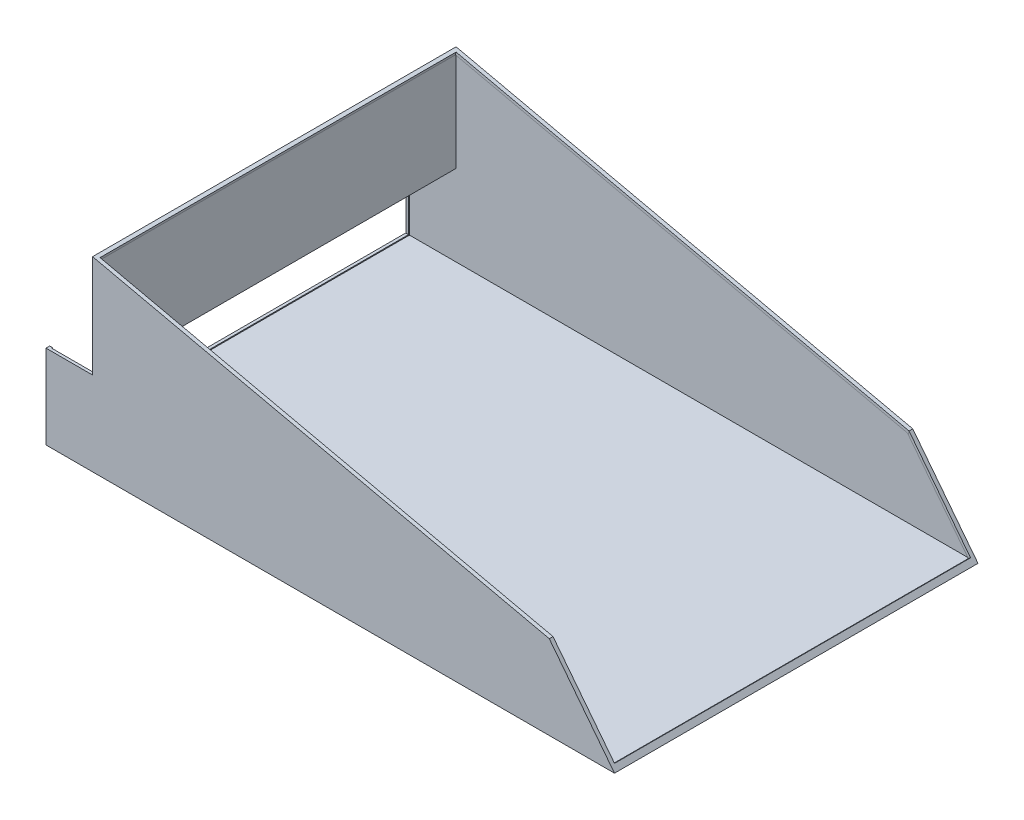
ISO-10303-21;
HEADER;
FILE_DESCRIPTION(('STEP AP214'),'2;1');
FILE_NAME('part.step','',(''),(''),'','','');
FILE_SCHEMA(('AUTOMOTIVE_DESIGN { 1 0 10303 214 1 1 1 1 }'));
ENDSEC;
DATA;
#1=APPLICATION_CONTEXT('core data for automotive mechanical design processes');
#2=APPLICATION_PROTOCOL_DEFINITION('international standard','automotive_design',2000,#1);
#3=PRODUCT_CONTEXT('',#1,'mechanical');
#4=PRODUCT('Part','Part','',(#3));
#5=PRODUCT_RELATED_PRODUCT_CATEGORY('part','',(#4));
#6=PRODUCT_DEFINITION_FORMATION('','',#4);
#7=PRODUCT_DEFINITION_CONTEXT('part definition',#1,'design');
#8=PRODUCT_DEFINITION('design','',#6,#7);
#9=PRODUCT_DEFINITION_SHAPE('','',#8);
#10=(LENGTH_UNIT() NAMED_UNIT(*) SI_UNIT(.MILLI.,.METRE.));
#11=(NAMED_UNIT(*) PLANE_ANGLE_UNIT() SI_UNIT($,.RADIAN.));
#12=(NAMED_UNIT(*) SI_UNIT($,.STERADIAN.) SOLID_ANGLE_UNIT());
#13=UNCERTAINTY_MEASURE_WITH_UNIT(LENGTH_MEASURE(1.E-05),#10,'distance_accuracy_value','');
#14=(GEOMETRIC_REPRESENTATION_CONTEXT(3) GLOBAL_UNCERTAINTY_ASSIGNED_CONTEXT((#13)) GLOBAL_UNIT_ASSIGNED_CONTEXT((#10,
#11,#12)) REPRESENTATION_CONTEXT('',''));
#15=CARTESIAN_POINT('',(0.,0.,0.));
#16=DIRECTION('',(0.,0.,1.));
#17=DIRECTION('',(1.,0.,0.));
#18=AXIS2_PLACEMENT_3D('',#15,#16,#17);
#19=CARTESIAN_POINT('',(0.,45.,97.5));
#20=DIRECTION('',(0.,-1.,0.));
#21=DIRECTION('',(1.,0.,0.));
#22=AXIS2_PLACEMENT_3D('',#19,#20,#21);
#23=PLANE('',#22);
#24=DIRECTION('',(-1.,0.,0.));
#25=VECTOR('',#24,1.);
#26=CARTESIAN_POINT('',(0.,45.,-96.));
#27=LINE('',#26,#25);
#28=CARTESIAN_POINT('',(0.,45.,-96.));
#29=VERTEX_POINT('',#28);
#30=CARTESIAN_POINT('',(-23.5,45.,-96.));
#31=VERTEX_POINT('',#30);
#32=EDGE_CURVE('E11',#29,#31,#27,.T.);
#33=ORIENTED_EDGE('',*,*,#32,.F.);
#34=DIRECTION('',(0.,0.,-1.));
#35=VECTOR('',#34,1.);
#36=CARTESIAN_POINT('',(0.,45.,97.5));
#37=LINE('',#36,#35);
#38=CARTESIAN_POINT('',(0.,45.,-97.5));
#39=VERTEX_POINT('',#38);
#40=EDGE_CURVE('E421',#29,#39,#37,.T.);
#41=ORIENTED_EDGE('',*,*,#40,.T.);
#42=DIRECTION('',(-1.,0.,0.));
#43=VECTOR('',#42,1.);
#44=CARTESIAN_POINT('',(0.,45.,-97.5));
#45=LINE('',#44,#43);
#46=CARTESIAN_POINT('',(-25.,45.,-97.5));
#47=VERTEX_POINT('',#46);
#48=EDGE_CURVE('E410',#39,#47,#45,.T.);
#49=ORIENTED_EDGE('',*,*,#48,.T.);
#50=DIRECTION('',(0.,0.,-1.));
#51=VECTOR('',#50,1.);
#52=CARTESIAN_POINT('',(-25.,45.,97.5));
#53=LINE('',#52,#51);
#54=CARTESIAN_POINT('',(-25.,45.,-95.5));
#55=VERTEX_POINT('',#54);
#56=EDGE_CURVE('E417',#55,#47,#53,.T.);
#57=ORIENTED_EDGE('',*,*,#56,.F.);
#58=DIRECTION('',(1.,0.,0.));
#59=VECTOR('',#58,1.);
#60=CARTESIAN_POINT('',(-25.,45.,-95.5));
#61=LINE('',#60,#59);
#62=CARTESIAN_POINT('',(-23.5,45.,-95.5));
#63=VERTEX_POINT('',#62);
#64=EDGE_CURVE('E370',#63,#55,#61,.F.);
#65=ORIENTED_EDGE('',*,*,#64,.F.);
#66=DIRECTION('',(0.,0.,-1.));
#67=VECTOR('',#66,1.);
#68=CARTESIAN_POINT('',(-23.5,45.,97.5));
#69=LINE('',#68,#67);
#70=EDGE_CURVE('E328',#63,#31,#69,.T.);
#71=ORIENTED_EDGE('',*,*,#70,.T.);
#72=EDGE_LOOP('',(#33,#41,#49,#57,#65,#71));
#73=FACE_BOUND('',#72,.T.);
#74=ADVANCED_FACE('F37',(#73),#23,.F.);
#75=CARTESIAN_POINT('',(-25.,45.,97.5));
#76=DIRECTION('',(1.,0.,0.));
#77=DIRECTION('',(0.,1.,0.));
#78=AXIS2_PLACEMENT_3D('',#75,#76,#77);
#79=PLANE('',#78);
#80=DIRECTION('',(0.,-1.,0.));
#81=VECTOR('',#80,1.);
#82=CARTESIAN_POINT('',(-25.,45.,-95.5));
#83=LINE('',#82,#81);
#84=CARTESIAN_POINT('',(-25.,43.0000000000001,-95.5));
#85=VERTEX_POINT('',#84);
#86=EDGE_CURVE('E41',#55,#85,#83,.T.);
#87=ORIENTED_EDGE('',*,*,#86,.F.);
#88=ORIENTED_EDGE('',*,*,#56,.T.);
#89=DIRECTION('',(0.,-1.,0.));
#90=VECTOR('',#89,1.);
#91=CARTESIAN_POINT('',(-25.,45.,-97.5));
#92=LINE('',#91,#90);
#93=CARTESIAN_POINT('',(-25.,0.,-97.5));
#94=VERTEX_POINT('',#93);
#95=EDGE_CURVE('E390',#47,#94,#92,.T.);
#96=ORIENTED_EDGE('',*,*,#95,.T.);
#97=DIRECTION('',(0.,0.,-1.));
#98=VECTOR('',#97,1.);
#99=CARTESIAN_POINT('',(-25.,0.,97.5));
#100=LINE('',#99,#98);
#101=CARTESIAN_POINT('',(-25.,0.,97.5));
#102=VERTEX_POINT('',#101);
#103=EDGE_CURVE('E400',#102,#94,#100,.T.);
#104=ORIENTED_EDGE('',*,*,#103,.F.);
#105=DIRECTION('',(0.,-1.,0.));
#106=VECTOR('',#105,1.);
#107=CARTESIAN_POINT('',(-25.,45.,97.5));
#108=LINE('',#107,#106);
#109=CARTESIAN_POINT('',(-25.,45.,97.5));
#110=VERTEX_POINT('',#109);
#111=EDGE_CURVE('E398',#110,#102,#108,.T.);
#112=ORIENTED_EDGE('',*,*,#111,.F.);
#113=CARTESIAN_POINT('',(-25.,45.,95.5));
#114=VERTEX_POINT('',#113);
#115=EDGE_CURVE('E418',#110,#114,#53,.T.);
#116=ORIENTED_EDGE('',*,*,#115,.T.);
#117=DIRECTION('',(0.,1.,0.));
#118=VECTOR('',#117,1.);
#119=CARTESIAN_POINT('',(-25.,45.,95.5));
#120=LINE('',#119,#118);
#121=CARTESIAN_POINT('',(-25.,43.,95.5));
#122=VERTEX_POINT('',#121);
#123=EDGE_CURVE('E256',#122,#114,#120,.T.);
#124=ORIENTED_EDGE('',*,*,#123,.F.);
#125=DIRECTION('',(0.,1.,0.));
#126=VECTOR('',#125,1.);
#127=CARTESIAN_POINT('',(-25.,45.,95.5));
#128=LINE('',#127,#126);
#129=CARTESIAN_POINT('',(-25.,2.,95.5));
#130=VERTEX_POINT('',#129);
#131=EDGE_CURVE('E261',#130,#122,#128,.T.);
#132=ORIENTED_EDGE('',*,*,#131,.F.);
#133=DIRECTION('',(0.,0.,1.));
#134=VECTOR('',#133,1.);
#135=CARTESIAN_POINT('',(-25.,2.,97.5));
#136=LINE('',#135,#134);
#137=CARTESIAN_POINT('',(-25.,2.,-95.5));
#138=VERTEX_POINT('',#137);
#139=EDGE_CURVE('E264',#138,#130,#136,.T.);
#140=ORIENTED_EDGE('',*,*,#139,.F.);
#141=DIRECTION('',(0.,-1.,0.));
#142=VECTOR('',#141,1.);
#143=CARTESIAN_POINT('',(-25.,45.,-95.5));
#144=LINE('',#143,#142);
#145=EDGE_CURVE('E266',#85,#138,#144,.T.);
#146=ORIENTED_EDGE('',*,*,#145,.F.);
#147=EDGE_LOOP('',(#87,#88,#96,#104,#112,#116,#124,#132,#140,#146));
#148=FACE_BOUND('',#147,.T.);
#149=ADVANCED_FACE('F523',(#148),#79,.F.);
#150=CARTESIAN_POINT('',(0.,100.,97.5));
#151=DIRECTION('',(-0.21903834230672,-0.975716252093571,0.));
#152=DIRECTION('',(0.975716252093571,-0.21903834230672,0.));
#153=AXIS2_PLACEMENT_3D('',#150,#151,#152);
#154=PLANE('',#153);
#155=DIRECTION('',(-0.975716252093571,0.21903834230672,0.));
#156=VECTOR('',#155,1.);
#157=CARTESIAN_POINT('',(0.,100.,-95.5));
#158=LINE('',#157,#156);
#159=CARTESIAN_POINT('',(245.,45.,-95.5));
#160=VERTEX_POINT('',#159);
#161=CARTESIAN_POINT('',(2.,99.5510204081633,-95.5));
#162=VERTEX_POINT('',#161);
#163=EDGE_CURVE('E253',#160,#162,#158,.T.);
#164=ORIENTED_EDGE('',*,*,#163,.F.);
#165=DIRECTION('',(0.,0.,-1.));
#166=VECTOR('',#165,1.);
#167=CARTESIAN_POINT('',(245.,45.,97.5));
#168=LINE('',#167,#166);
#169=CARTESIAN_POINT('',(245.,45.,-97.5));
#170=VERTEX_POINT('',#169);
#171=EDGE_CURVE('E428',#160,#170,#168,.T.);
#172=ORIENTED_EDGE('',*,*,#171,.T.);
#173=DIRECTION('',(-0.97571625209357,0.21903834230672,0.));
#174=VECTOR('',#173,1.);
#175=CARTESIAN_POINT('',(0.,100.,-97.5));
#176=LINE('',#175,#174);
#177=CARTESIAN_POINT('',(0.,100.,-97.5));
#178=VERTEX_POINT('',#177);
#179=EDGE_CURVE('E405',#170,#178,#176,.T.);
#180=ORIENTED_EDGE('',*,*,#179,.T.);
#181=DIRECTION('',(0.,0.,-1.));
#182=VECTOR('',#181,1.);
#183=CARTESIAN_POINT('',(0.,100.,97.5));
#184=LINE('',#183,#182);
#185=CARTESIAN_POINT('',(0.,100.,97.5));
#186=VERTEX_POINT('',#185);
#187=EDGE_CURVE('E424',#186,#178,#184,.T.);
#188=ORIENTED_EDGE('',*,*,#187,.F.);
#189=DIRECTION('',(-0.97571625209357,0.21903834230672,0.));
#190=VECTOR('',#189,1.);
#191=CARTESIAN_POINT('',(0.,100.,97.5));
#192=LINE('',#191,#190);
#193=CARTESIAN_POINT('',(245.,45.,97.5));
#194=VERTEX_POINT('',#193);
#195=EDGE_CURVE('E392',#194,#186,#192,.T.);
#196=ORIENTED_EDGE('',*,*,#195,.F.);
#197=CARTESIAN_POINT('',(245.,45.,95.5));
#198=VERTEX_POINT('',#197);
#199=EDGE_CURVE('E429',#194,#198,#168,.T.);
#200=ORIENTED_EDGE('',*,*,#199,.T.);
#201=DIRECTION('',(0.975716252093571,-0.21903834230672,0.));
#202=VECTOR('',#201,1.);
#203=CARTESIAN_POINT('',(0.,100.,95.5));
#204=LINE('',#203,#202);
#205=CARTESIAN_POINT('',(2.,99.5510204081633,95.5));
#206=VERTEX_POINT('',#205);
#207=EDGE_CURVE('E246',#206,#198,#204,.T.);
#208=ORIENTED_EDGE('',*,*,#207,.F.);
#209=DIRECTION('',(0.,0.,1.));
#210=VECTOR('',#209,1.);
#211=CARTESIAN_POINT('',(2.,99.5510204081633,97.5));
#212=LINE('',#211,#210);
#213=EDGE_CURVE('E250',#162,#206,#212,.T.);
#214=ORIENTED_EDGE('',*,*,#213,.F.);
#215=EDGE_LOOP('',(#164,#172,#180,#188,#196,#200,#208,#214));
#216=FACE_BOUND('',#215,.T.);
#217=ADVANCED_FACE('F445',(#216),#154,.F.);
#218=CARTESIAN_POINT('',(245.,45.,97.5));
#219=DIRECTION('',(-0.789352217376326,-0.61394061351492,0.));
#220=DIRECTION('',(0.61394061351492,-0.789352217376327,0.));
#221=AXIS2_PLACEMENT_3D('',#218,#219,#220);
#222=PLANE('',#221);
#223=DIRECTION('',(-0.61394061351492,0.789352217376327,0.));
#224=VECTOR('',#223,1.);
#225=CARTESIAN_POINT('',(245.,45.,-95.5));
#226=LINE('',#225,#224);
#227=CARTESIAN_POINT('',(278.,2.57142857142854,-95.5));
#228=VERTEX_POINT('',#227);
#229=EDGE_CURVE('E240',#228,#160,#226,.T.);
#230=ORIENTED_EDGE('',*,*,#229,.F.);
#231=DIRECTION('',(0.,0.,-1.));
#232=VECTOR('',#231,1.);
#233=CARTESIAN_POINT('',(278.,2.57142857142854,97.5));
#234=LINE('',#233,#232);
#235=CARTESIAN_POINT('',(278.,2.57142857142856,95.5));
#236=VERTEX_POINT('',#235);
#237=EDGE_CURVE('E225',#236,#228,#234,.T.);
#238=ORIENTED_EDGE('',*,*,#237,.F.);
#239=DIRECTION('',(0.61394061351492,-0.789352217376327,0.));
#240=VECTOR('',#239,1.);
#241=CARTESIAN_POINT('',(245.,45.,95.5));
#242=LINE('',#241,#240);
#243=EDGE_CURVE('E212',#198,#236,#242,.T.);
#244=ORIENTED_EDGE('',*,*,#243,.F.);
#245=ORIENTED_EDGE('',*,*,#199,.F.);
#246=DIRECTION('',(-0.61394061351492,0.789352217376327,0.));
#247=VECTOR('',#246,1.);
#248=CARTESIAN_POINT('',(245.,45.,97.5));
#249=LINE('',#248,#247);
#250=CARTESIAN_POINT('',(280.,0.,97.5));
#251=VERTEX_POINT('',#250);
#252=EDGE_CURVE('E389',#251,#194,#249,.T.);
#253=ORIENTED_EDGE('',*,*,#252,.F.);
#254=DIRECTION('',(0.,0.,-1.));
#255=VECTOR('',#254,1.);
#256=CARTESIAN_POINT('',(280.,0.,97.5));
#257=LINE('',#256,#255);
#258=CARTESIAN_POINT('',(280.,0.,-97.5));
#259=VERTEX_POINT('',#258);
#260=EDGE_CURVE('E226',#251,#259,#257,.T.);
#261=ORIENTED_EDGE('',*,*,#260,.T.);
#262=DIRECTION('',(-0.61394061351492,0.789352217376327,0.));
#263=VECTOR('',#262,1.);
#264=CARTESIAN_POINT('',(245.,45.,-97.5));
#265=LINE('',#264,#263);
#266=EDGE_CURVE('E402',#259,#170,#265,.T.);
#267=ORIENTED_EDGE('',*,*,#266,.T.);
#268=ORIENTED_EDGE('',*,*,#171,.F.);
#269=EDGE_LOOP('',(#230,#238,#244,#245,#253,#261,#267,#268));
#270=FACE_BOUND('',#269,.T.);
#271=ADVANCED_FACE('F238',(#270),#222,.F.);
#272=CARTESIAN_POINT('',(280.,0.,97.5));
#273=DIRECTION('',(0.,1.,0.));
#274=DIRECTION('',(-1.,0.,0.));
#275=AXIS2_PLACEMENT_3D('',#272,#273,#274);
#276=PLANE('',#275);
#277=DIRECTION('',(1.,0.,0.));
#278=VECTOR('',#277,1.);
#279=CARTESIAN_POINT('',(280.,0.,-97.5));
#280=LINE('',#279,#278);
#281=EDGE_CURVE('E345',#94,#259,#280,.T.);
#282=ORIENTED_EDGE('',*,*,#281,.T.);
#283=ORIENTED_EDGE('',*,*,#260,.F.);
#284=DIRECTION('',(1.,0.,0.));
#285=VECTOR('',#284,1.);
#286=CARTESIAN_POINT('',(-25.,0.,97.5));
#287=LINE('',#286,#285);
#288=EDGE_CURVE('E387',#102,#251,#287,.T.);
#289=ORIENTED_EDGE('',*,*,#288,.F.);
#290=ORIENTED_EDGE('',*,*,#103,.T.);
#291=EDGE_LOOP('',(#282,#283,#289,#290));
#292=FACE_BOUND('',#291,.T.);
#293=ADVANCED_FACE('F39',(#292),#276,.F.);
#294=CARTESIAN_POINT('',(0.,45.,97.5));
#295=DIRECTION('',(1.,0.,0.));
#296=DIRECTION('',(0.,0.,-1.));
#297=AXIS2_PLACEMENT_3D('',#294,#295,#296);
#298=PLANE('',#297);
#299=DIRECTION('',(0.,-1.,0.));
#300=VECTOR('',#299,1.);
#301=CARTESIAN_POINT('',(0.,45.,-97.5));
#302=LINE('',#301,#300);
#303=EDGE_CURVE('E407',#178,#39,#302,.T.);
#304=ORIENTED_EDGE('',*,*,#303,.T.);
#305=ORIENTED_EDGE('',*,*,#40,.F.);
#306=CARTESIAN_POINT('',(0.,45.,96.));
#307=VERTEX_POINT('',#306);
#308=EDGE_CURVE('E425',#307,#29,#37,.T.);
#309=ORIENTED_EDGE('',*,*,#308,.F.);
#310=CARTESIAN_POINT('',(0.,45.,97.5));
#311=VERTEX_POINT('',#310);
#312=EDGE_CURVE('E422',#311,#307,#37,.T.);
#313=ORIENTED_EDGE('',*,*,#312,.F.);
#314=DIRECTION('',(0.,-1.,0.));
#315=VECTOR('',#314,1.);
#316=CARTESIAN_POINT('',(0.,45.,97.5));
#317=LINE('',#316,#315);
#318=EDGE_CURVE('E394',#186,#311,#317,.T.);
#319=ORIENTED_EDGE('',*,*,#318,.F.);
#320=ORIENTED_EDGE('',*,*,#187,.T.);
#321=EDGE_LOOP('',(#304,#305,#309,#313,#319,#320));
#322=FACE_BOUND('',#321,.T.);
#323=ADVANCED_FACE('F449',(#322),#298,.F.);
#324=DIRECTION('',(0.,0.,-1.));
#325=VECTOR('',#324,1.);
#326=CARTESIAN_POINT('',(-23.5,45.,97.5));
#327=LINE('',#326,#325);
#328=CARTESIAN_POINT('',(-23.5,45.,96.));
#329=VERTEX_POINT('',#328);
#330=CARTESIAN_POINT('',(-23.5,45.,95.5));
#331=VERTEX_POINT('',#330);
#332=EDGE_CURVE('E326',#329,#331,#327,.T.);
#333=ORIENTED_EDGE('',*,*,#332,.T.);
#334=DIRECTION('',(-1.,0.,0.));
#335=VECTOR('',#334,1.);
#336=CARTESIAN_POINT('',(-25.,45.,95.5));
#337=LINE('',#336,#335);
#338=EDGE_CURVE('E375',#331,#114,#337,.T.);
#339=ORIENTED_EDGE('',*,*,#338,.T.);
#340=ORIENTED_EDGE('',*,*,#115,.F.);
#341=DIRECTION('',(-1.,0.,0.));
#342=VECTOR('',#341,1.);
#343=CARTESIAN_POINT('',(0.,45.,97.5));
#344=LINE('',#343,#342);
#345=EDGE_CURVE('E396',#311,#110,#344,.T.);
#346=ORIENTED_EDGE('',*,*,#345,.F.);
#347=ORIENTED_EDGE('',*,*,#312,.T.);
#348=DIRECTION('',(-1.,0.,0.));
#349=VECTOR('',#348,1.);
#350=CARTESIAN_POINT('',(0.,45.,96.));
#351=LINE('',#350,#349);
#352=EDGE_CURVE('E46',#307,#329,#351,.T.);
#353=ORIENTED_EDGE('',*,*,#352,.T.);
#354=EDGE_LOOP('',(#333,#339,#340,#346,#347,#353));
#355=FACE_BOUND('',#354,.T.);
#356=ADVANCED_FACE('F525',(#355),#23,.F.);
#357=CARTESIAN_POINT('',(0.,0.,97.5));
#358=DIRECTION('',(0.,0.,1.));
#359=DIRECTION('',(1.,0.,0.));
#360=AXIS2_PLACEMENT_3D('',#357,#358,#359);
#361=PLANE('',#360);
#362=ORIENTED_EDGE('',*,*,#288,.T.);
#363=ORIENTED_EDGE('',*,*,#252,.T.);
#364=ORIENTED_EDGE('',*,*,#195,.T.);
#365=ORIENTED_EDGE('',*,*,#318,.T.);
#366=ORIENTED_EDGE('',*,*,#345,.T.);
#367=ORIENTED_EDGE('',*,*,#111,.T.);
#368=EDGE_LOOP('',(#362,#363,#364,#365,#366,#367));
#369=FACE_BOUND('',#368,.T.);
#370=ADVANCED_FACE('F454',(#369),#361,.T.);
#371=CARTESIAN_POINT('',(0.,0.,-97.5));
#372=DIRECTION('',(0.,0.,1.));
#373=DIRECTION('',(1.,0.,0.));
#374=AXIS2_PLACEMENT_3D('',#371,#372,#373);
#375=PLANE('',#374);
#376=ORIENTED_EDGE('',*,*,#281,.F.);
#377=ORIENTED_EDGE('',*,*,#95,.F.);
#378=ORIENTED_EDGE('',*,*,#48,.F.);
#379=ORIENTED_EDGE('',*,*,#303,.F.);
#380=ORIENTED_EDGE('',*,*,#179,.F.);
#381=ORIENTED_EDGE('',*,*,#266,.F.);
#382=EDGE_LOOP('',(#376,#377,#378,#379,#380,#381));
#383=FACE_BOUND('',#382,.T.);
#384=ADVANCED_FACE('F438',(#383),#375,.F.);
#385=CARTESIAN_POINT('',(0.,45.,97.5));
#386=DIRECTION('',(0.,-1.,0.));
#387=DIRECTION('',(1.,0.,0.));
#388=AXIS2_PLACEMENT_3D('',#385,#386,#387);
#389=PLANE('',#388);
#390=ORIENTED_EDGE('',*,*,#308,.T.);
#391=CARTESIAN_POINT('',(1.5,45.,-96.));
#392=VERTEX_POINT('',#391);
#393=EDGE_CURVE('E48',#392,#29,#27,.T.);
#394=ORIENTED_EDGE('',*,*,#393,.F.);
#395=DIRECTION('',(0.,0.,-1.));
#396=VECTOR('',#395,1.);
#397=CARTESIAN_POINT('',(1.5,45.,97.5));
#398=LINE('',#397,#396);
#399=CARTESIAN_POINT('',(1.5,45.,96.));
#400=VERTEX_POINT('',#399);
#401=EDGE_CURVE('E327',#400,#392,#398,.T.);
#402=ORIENTED_EDGE('',*,*,#401,.F.);
#403=EDGE_CURVE('E281',#400,#307,#351,.T.);
#404=ORIENTED_EDGE('',*,*,#403,.T.);
#405=EDGE_LOOP('',(#390,#394,#402,#404));
#406=FACE_BOUND('',#405,.T.);
#407=ADVANCED_FACE('F569',(#406),#389,.T.);
#408=CARTESIAN_POINT('',(-25.,45.,95.5));
#409=DIRECTION('',(0.,0.,-1.));
#410=DIRECTION('',(0.,1.,0.));
#411=AXIS2_PLACEMENT_3D('',#408,#409,#410);
#412=PLANE('',#411);
#413=ORIENTED_EDGE('',*,*,#123,.T.);
#414=ORIENTED_EDGE('',*,*,#338,.F.);
#415=DIRECTION('',(0.,-1.,0.));
#416=VECTOR('',#415,1.);
#417=CARTESIAN_POINT('',(-23.5,45.,95.5));
#418=LINE('',#417,#416);
#419=CARTESIAN_POINT('',(-23.5,43.,95.5));
#420=VERTEX_POINT('',#419);
#421=EDGE_CURVE('E235',#420,#331,#418,.F.);
#422=ORIENTED_EDGE('',*,*,#421,.F.);
#423=DIRECTION('',(1.,0.,0.));
#424=VECTOR('',#423,1.);
#425=CARTESIAN_POINT('',(-25.,43.,95.5));
#426=LINE('',#425,#424);
#427=EDGE_CURVE('E55',#420,#122,#426,.F.);
#428=ORIENTED_EDGE('',*,*,#427,.T.);
#429=EDGE_LOOP('',(#413,#414,#422,#428));
#430=FACE_BOUND('',#429,.T.);
#431=ADVANCED_FACE('F605',(#430),#412,.T.);
#432=CARTESIAN_POINT('',(-25.,45.,95.5));
#433=DIRECTION('',(0.,0.,-1.));
#434=DIRECTION('',(0.,1.,0.));
#435=AXIS2_PLACEMENT_3D('',#432,#433,#434);
#436=PLANE('',#435);
#437=ORIENTED_EDGE('',*,*,#131,.T.);
#438=ORIENTED_EDGE('',*,*,#427,.F.);
#439=DIRECTION('',(0.,-1.,0.));
#440=VECTOR('',#439,1.);
#441=CARTESIAN_POINT('',(-23.5,45.,95.5));
#442=LINE('',#441,#440);
#443=CARTESIAN_POINT('',(-23.5,2.,95.5));
#444=VERTEX_POINT('',#443);
#445=EDGE_CURVE('E320',#444,#420,#442,.F.);
#446=ORIENTED_EDGE('',*,*,#445,.F.);
#447=DIRECTION('',(1.,0.,0.));
#448=VECTOR('',#447,1.);
#449=CARTESIAN_POINT('',(-25.,2.,95.5));
#450=LINE('',#449,#448);
#451=EDGE_CURVE('E372',#444,#130,#450,.F.);
#452=ORIENTED_EDGE('',*,*,#451,.T.);
#453=EDGE_LOOP('',(#437,#438,#446,#452));
#454=FACE_BOUND('',#453,.T.);
#455=ADVANCED_FACE('F678',(#454),#436,.T.);
#456=CARTESIAN_POINT('',(-25.,2.,97.5));
#457=DIRECTION('',(0.,1.,0.));
#458=DIRECTION('',(0.,0.,1.));
#459=AXIS2_PLACEMENT_3D('',#456,#457,#458);
#460=PLANE('',#459);
#461=ORIENTED_EDGE('',*,*,#139,.T.);
#462=ORIENTED_EDGE('',*,*,#451,.F.);
#463=DIRECTION('',(0.,0.,-1.));
#464=VECTOR('',#463,1.);
#465=CARTESIAN_POINT('',(-23.5,2.,97.5));
#466=LINE('',#465,#464);
#467=CARTESIAN_POINT('',(-23.5,2.,-95.5));
#468=VERTEX_POINT('',#467);
#469=EDGE_CURVE('E316',#468,#444,#466,.F.);
#470=ORIENTED_EDGE('',*,*,#469,.F.);
#471=DIRECTION('',(1.,0.,0.));
#472=VECTOR('',#471,1.);
#473=CARTESIAN_POINT('',(-25.,2.,-95.5));
#474=LINE('',#473,#472);
#475=EDGE_CURVE('E369',#468,#138,#474,.F.);
#476=ORIENTED_EDGE('',*,*,#475,.T.);
#477=EDGE_LOOP('',(#461,#462,#470,#476));
#478=FACE_BOUND('',#477,.T.);
#479=ADVANCED_FACE('F686',(#478),#460,.T.);
#480=CARTESIAN_POINT('',(-25.,45.,-95.5));
#481=DIRECTION('',(0.,0.,1.));
#482=DIRECTION('',(0.,-1.,0.));
#483=AXIS2_PLACEMENT_3D('',#480,#481,#482);
#484=PLANE('',#483);
#485=ORIENTED_EDGE('',*,*,#145,.T.);
#486=ORIENTED_EDGE('',*,*,#475,.F.);
#487=DIRECTION('',(0.,1.,0.));
#488=VECTOR('',#487,1.);
#489=CARTESIAN_POINT('',(-23.5,45.,-95.5));
#490=LINE('',#489,#488);
#491=CARTESIAN_POINT('',(-23.5,43.0000000000001,-95.5));
#492=VERTEX_POINT('',#491);
#493=EDGE_CURVE('E311',#492,#468,#490,.F.);
#494=ORIENTED_EDGE('',*,*,#493,.F.);
#495=DIRECTION('',(1.,0.,0.));
#496=VECTOR('',#495,1.);
#497=CARTESIAN_POINT('',(-25.,43.0000000000001,-95.5));
#498=LINE('',#497,#496);
#499=EDGE_CURVE('E367',#492,#85,#498,.F.);
#500=ORIENTED_EDGE('',*,*,#499,.T.);
#501=EDGE_LOOP('',(#485,#486,#494,#500));
#502=FACE_BOUND('',#501,.T.);
#503=ADVANCED_FACE('F695',(#502),#484,.T.);
#504=CARTESIAN_POINT('',(-25.,45.,-95.5));
#505=DIRECTION('',(0.,0.,1.));
#506=DIRECTION('',(0.,-1.,0.));
#507=AXIS2_PLACEMENT_3D('',#504,#505,#506);
#508=PLANE('',#507);
#509=ORIENTED_EDGE('',*,*,#86,.T.);
#510=ORIENTED_EDGE('',*,*,#499,.F.);
#511=DIRECTION('',(0.,1.,0.));
#512=VECTOR('',#511,1.);
#513=CARTESIAN_POINT('',(-23.5,45.,-95.5));
#514=LINE('',#513,#512);
#515=EDGE_CURVE('E307',#63,#492,#514,.F.);
#516=ORIENTED_EDGE('',*,*,#515,.F.);
#517=ORIENTED_EDGE('',*,*,#64,.T.);
#518=EDGE_LOOP('',(#509,#510,#516,#517));
#519=FACE_BOUND('',#518,.T.);
#520=ADVANCED_FACE('F704',(#519),#508,.T.);
#521=CARTESIAN_POINT('',(0.,100.,95.5));
#522=DIRECTION('',(0.,0.,-1.));
#523=DIRECTION('',(0.975716252093571,-0.21903834230672,0.));
#524=AXIS2_PLACEMENT_3D('',#521,#522,#523);
#525=PLANE('',#524);
#526=ORIENTED_EDGE('',*,*,#207,.T.);
#527=DIRECTION('',(-0.789352217376326,-0.61394061351492,0.));
#528=VECTOR('',#527,1.);
#529=CARTESIAN_POINT('',(245.,45.,95.5));
#530=LINE('',#529,#528);
#531=CARTESIAN_POINT('',(243.466145939836,43.8070023976503,95.5));
#532=VERTEX_POINT('',#531);
#533=EDGE_CURVE('E219',#532,#198,#530,.F.);
#534=ORIENTED_EDGE('',*,*,#533,.F.);
#535=DIRECTION('',(-0.975716252093571,0.21903834230672,0.));
#536=VECTOR('',#535,1.);
#537=CARTESIAN_POINT('',(-0.328557513460081,98.5364256218596,95.5));
#538=LINE('',#537,#536);
#539=CARTESIAN_POINT('',(1.67144248653992,98.0874460300229,95.5));
#540=VERTEX_POINT('',#539);
#541=EDGE_CURVE('E312',#540,#532,#538,.F.);
#542=ORIENTED_EDGE('',*,*,#541,.F.);
#543=DIRECTION('',(-0.21903834230672,-0.975716252093571,0.));
#544=VECTOR('',#543,1.);
#545=CARTESIAN_POINT('',(2.,99.5510204081633,95.5));
#546=LINE('',#545,#544);
#547=EDGE_CURVE('E63',#540,#206,#546,.F.);
#548=ORIENTED_EDGE('',*,*,#547,.T.);
#549=EDGE_LOOP('',(#526,#534,#542,#548));
#550=FACE_BOUND('',#549,.T.);
#551=ADVANCED_FACE('F458',(#550),#525,.T.);
#552=CARTESIAN_POINT('',(2.,99.5510204081633,97.5));
#553=DIRECTION('',(0.975716252093571,-0.21903834230672,0.));
#554=DIRECTION('',(0.,0.,1.));
#555=AXIS2_PLACEMENT_3D('',#552,#553,#554);
#556=PLANE('',#555);
#557=ORIENTED_EDGE('',*,*,#213,.T.);
#558=ORIENTED_EDGE('',*,*,#547,.F.);
#559=DIRECTION('',(0.,0.,-1.));
#560=VECTOR('',#559,1.);
#561=CARTESIAN_POINT('',(1.67144248653992,98.0874460300229,97.5));
#562=LINE('',#561,#560);
#563=CARTESIAN_POINT('',(1.67144248653992,98.0874460300229,-95.5));
#564=VERTEX_POINT('',#563);
#565=EDGE_CURVE('E355',#564,#540,#562,.F.);
#566=ORIENTED_EDGE('',*,*,#565,.F.);
#567=DIRECTION('',(-0.21903834230672,-0.975716252093571,0.));
#568=VECTOR('',#567,1.);
#569=CARTESIAN_POINT('',(2.,99.5510204081633,-95.5));
#570=LINE('',#569,#568);
#571=EDGE_CURVE('E381',#564,#162,#570,.F.);
#572=ORIENTED_EDGE('',*,*,#571,.T.);
#573=EDGE_LOOP('',(#557,#558,#566,#572));
#574=FACE_BOUND('',#573,.T.);
#575=ADVANCED_FACE('F508',(#574),#556,.T.);
#576=CARTESIAN_POINT('',(0.,100.,-95.5));
#577=DIRECTION('',(0.,0.,1.));
#578=DIRECTION('',(-0.975716252093571,0.21903834230672,0.));
#579=AXIS2_PLACEMENT_3D('',#576,#577,#578);
#580=PLANE('',#579);
#581=ORIENTED_EDGE('',*,*,#163,.T.);
#582=ORIENTED_EDGE('',*,*,#571,.F.);
#583=DIRECTION('',(0.975716252093571,-0.21903834230672,0.));
#584=VECTOR('',#583,1.);
#585=CARTESIAN_POINT('',(-0.328557513460081,98.5364256218596,-95.5));
#586=LINE('',#585,#584);
#587=CARTESIAN_POINT('',(244.146362645029,43.6543006883212,-95.5));
#588=VERTEX_POINT('',#587);
#589=EDGE_CURVE('E351',#588,#564,#586,.F.);
#590=ORIENTED_EDGE('',*,*,#589,.F.);
#591=DIRECTION('',(-0.61394061351492,0.789352217376327,0.));
#592=VECTOR('',#591,1.);
#593=CARTESIAN_POINT('',(243.815971673936,44.0790890797276,-95.5));
#594=LINE('',#593,#592);
#595=CARTESIAN_POINT('',(244.574368902395,43.104006928851,-95.5));
#596=VERTEX_POINT('',#595);
#597=EDGE_CURVE('E340',#588,#596,#594,.F.);
#598=ORIENTED_EDGE('',*,*,#597,.T.);
#599=DIRECTION('',(-0.21903834230672,-0.975716252093571,0.));
#600=VECTOR('',#599,1.);
#601=CARTESIAN_POINT('',(245.,45.,-95.5));
#602=LINE('',#601,#600);
#603=EDGE_CURVE('E378',#596,#160,#602,.F.);
#604=ORIENTED_EDGE('',*,*,#603,.T.);
#605=EDGE_LOOP('',(#581,#582,#590,#598,#604));
#606=FACE_BOUND('',#605,.T.);
#607=ADVANCED_FACE('F509',(#606),#580,.T.);
#608=CARTESIAN_POINT('',(245.,45.,95.5));
#609=DIRECTION('',(0.,0.,-1.));
#610=DIRECTION('',(0.61394061351492,-0.789352217376327,0.));
#611=AXIS2_PLACEMENT_3D('',#608,#609,#610);
#612=PLANE('',#611);
#613=ORIENTED_EDGE('',*,*,#243,.T.);
#614=DIRECTION('',(-0.789352217376326,-0.61394061351492,0.));
#615=VECTOR('',#614,1.);
#616=CARTESIAN_POINT('',(278.,2.57142857142854,95.5));
#617=LINE('',#616,#615);
#618=CARTESIAN_POINT('',(276.815971673936,1.65051765115616,95.5));
#619=VERTEX_POINT('',#618);
#620=EDGE_CURVE('E216',#619,#236,#617,.F.);
#621=ORIENTED_EDGE('',*,*,#620,.F.);
#622=DIRECTION('',(-0.61394061351492,0.789352217376327,0.));
#623=VECTOR('',#622,1.);
#624=CARTESIAN_POINT('',(243.815971673936,44.0790890797276,95.5));
#625=LINE('',#624,#623);
#626=CARTESIAN_POINT('',(244.146362645029,43.6543006883212,95.5));
#627=VERTEX_POINT('',#626);
#628=EDGE_CURVE('E350',#627,#619,#625,.F.);
#629=ORIENTED_EDGE('',*,*,#628,.F.);
#630=DIRECTION('',(0.975716252093571,-0.21903834230672,0.));
#631=VECTOR('',#630,1.);
#632=CARTESIAN_POINT('',(-0.32855751346008,98.5364256218596,95.5));
#633=LINE('',#632,#631);
#634=EDGE_CURVE('E343',#627,#532,#633,.F.);
#635=ORIENTED_EDGE('',*,*,#634,.T.);
#636=ORIENTED_EDGE('',*,*,#533,.T.);
#637=EDGE_LOOP('',(#613,#621,#629,#635,#636));
#638=FACE_BOUND('',#637,.T.);
#639=ADVANCED_FACE('F214',(#638),#612,.T.);
#640=CARTESIAN_POINT('',(245.,45.,-95.5));
#641=DIRECTION('',(0.,0.,1.));
#642=DIRECTION('',(-0.61394061351492,0.789352217376327,0.));
#643=AXIS2_PLACEMENT_3D('',#640,#641,#642);
#644=PLANE('',#643);
#645=ORIENTED_EDGE('',*,*,#229,.T.);
#646=ORIENTED_EDGE('',*,*,#603,.F.);
#647=DIRECTION('',(0.61394061351492,-0.789352217376327,0.));
#648=VECTOR('',#647,1.);
#649=CARTESIAN_POINT('',(243.815971673936,44.0790890797276,-95.5));
#650=LINE('',#649,#648);
#651=CARTESIAN_POINT('',(276.815971673936,1.65051765115616,-95.5));
#652=VERTEX_POINT('',#651);
#653=EDGE_CURVE('E346',#652,#596,#650,.F.);
#654=ORIENTED_EDGE('',*,*,#653,.F.);
#655=DIRECTION('',(-0.789352217376326,-0.61394061351492,0.));
#656=VECTOR('',#655,1.);
#657=CARTESIAN_POINT('',(278.,2.57142857142854,-95.5));
#658=LINE('',#657,#656);
#659=EDGE_CURVE('E234',#652,#228,#658,.F.);
#660=ORIENTED_EDGE('',*,*,#659,.T.);
#661=EDGE_LOOP('',(#645,#646,#654,#660));
#662=FACE_BOUND('',#661,.T.);
#663=ADVANCED_FACE('F512',(#662),#644,.T.);
#664=CARTESIAN_POINT('',(278.,2.57142857142854,97.5));
#665=DIRECTION('',(-0.61394061351492,0.789352217376327,0.));
#666=DIRECTION('',(0.,0.,-1.));
#667=AXIS2_PLACEMENT_3D('',#664,#665,#666);
#668=PLANE('',#667);
#669=ORIENTED_EDGE('',*,*,#237,.T.);
#670=ORIENTED_EDGE('',*,*,#659,.F.);
#671=DIRECTION('',(0.,0.,1.));
#672=VECTOR('',#671,1.);
#673=CARTESIAN_POINT('',(276.815971673936,1.65051765115616,97.5));
#674=LINE('',#673,#672);
#675=EDGE_CURVE('E233',#619,#652,#674,.F.);
#676=ORIENTED_EDGE('',*,*,#675,.F.);
#677=ORIENTED_EDGE('',*,*,#620,.T.);
#678=EDGE_LOOP('',(#669,#670,#676,#677));
#679=FACE_BOUND('',#678,.T.);
#680=ADVANCED_FACE('F230',(#679),#668,.T.);
#681=CARTESIAN_POINT('',(-23.5,45.,97.5));
#682=DIRECTION('',(1.,0.,0.));
#683=DIRECTION('',(0.,1.,0.));
#684=AXIS2_PLACEMENT_3D('',#681,#682,#683);
#685=PLANE('',#684);
#686=ORIENTED_EDGE('',*,*,#515,.T.);
#687=ORIENTED_EDGE('',*,*,#493,.T.);
#688=ORIENTED_EDGE('',*,*,#469,.T.);
#689=ORIENTED_EDGE('',*,*,#445,.T.);
#690=ORIENTED_EDGE('',*,*,#421,.T.);
#691=ORIENTED_EDGE('',*,*,#332,.F.);
#692=DIRECTION('',(0.,-1.,0.));
#693=VECTOR('',#692,1.);
#694=CARTESIAN_POINT('',(-23.5,45.,96.));
#695=LINE('',#694,#693);
#696=CARTESIAN_POINT('',(-23.5,1.5,96.));
#697=VERTEX_POINT('',#696);
#698=EDGE_CURVE('E288',#329,#697,#695,.T.);
#699=ORIENTED_EDGE('',*,*,#698,.T.);
#700=DIRECTION('',(0.,0.,-1.));
#701=VECTOR('',#700,1.);
#702=CARTESIAN_POINT('',(-23.5,1.5,97.5));
#703=LINE('',#702,#701);
#704=CARTESIAN_POINT('',(-23.5,1.5,-96.));
#705=VERTEX_POINT('',#704);
#706=EDGE_CURVE('E294',#697,#705,#703,.T.);
#707=ORIENTED_EDGE('',*,*,#706,.T.);
#708=DIRECTION('',(0.,-1.,0.));
#709=VECTOR('',#708,1.);
#710=CARTESIAN_POINT('',(-23.5,45.,-96.));
#711=LINE('',#710,#709);
#712=EDGE_CURVE('E493',#31,#705,#711,.T.);
#713=ORIENTED_EDGE('',*,*,#712,.F.);
#714=ORIENTED_EDGE('',*,*,#70,.F.);
#715=EDGE_LOOP('',(#686,#687,#688,#689,#690,#691,#699,#707,#713,#714));
#716=FACE_BOUND('',#715,.T.);
#717=ADVANCED_FACE('F519',(#716),#685,.T.);
#718=CARTESIAN_POINT('',(-0.32855751346008,98.5364256218596,97.5));
#719=DIRECTION('',(-0.21903834230672,-0.975716252093571,0.));
#720=DIRECTION('',(0.975716252093571,-0.21903834230672,0.));
#721=AXIS2_PLACEMENT_3D('',#718,#719,#720);
#722=PLANE('',#721);
#723=ORIENTED_EDGE('',*,*,#589,.T.);
#724=ORIENTED_EDGE('',*,*,#565,.T.);
#725=ORIENTED_EDGE('',*,*,#541,.T.);
#726=ORIENTED_EDGE('',*,*,#634,.F.);
#727=DIRECTION('',(0.,0.,-1.));
#728=VECTOR('',#727,1.);
#729=CARTESIAN_POINT('',(244.146362645029,43.6543006883212,97.5));
#730=LINE('',#729,#728);
#731=CARTESIAN_POINT('',(244.146362645029,43.6543006883212,96.));
#732=VERTEX_POINT('',#731);
#733=EDGE_CURVE('E465',#732,#627,#730,.T.);
#734=ORIENTED_EDGE('',*,*,#733,.F.);
#735=DIRECTION('',(-0.975716252093571,0.21903834230672,0.));
#736=VECTOR('',#735,1.);
#737=CARTESIAN_POINT('',(-0.32855751346008,98.5364256218596,96.));
#738=LINE('',#737,#736);
#739=CARTESIAN_POINT('',(1.5,98.125933118838,96.));
#740=VERTEX_POINT('',#739);
#741=EDGE_CURVE('E296',#732,#740,#738,.T.);
#742=ORIENTED_EDGE('',*,*,#741,.T.);
#743=DIRECTION('',(0.,0.,-1.));
#744=VECTOR('',#743,1.);
#745=CARTESIAN_POINT('',(1.5,98.125933118838,97.5));
#746=LINE('',#745,#744);
#747=CARTESIAN_POINT('',(1.5,98.125933118838,-96.));
#748=VERTEX_POINT('',#747);
#749=EDGE_CURVE('E330',#740,#748,#746,.T.);
#750=ORIENTED_EDGE('',*,*,#749,.T.);
#751=DIRECTION('',(-0.975716252093571,0.21903834230672,0.));
#752=VECTOR('',#751,1.);
#753=CARTESIAN_POINT('',(-0.32855751346008,98.5364256218596,-96.));
#754=LINE('',#753,#752);
#755=CARTESIAN_POINT('',(244.146362645029,43.6543006883212,-96.));
#756=VERTEX_POINT('',#755);
#757=EDGE_CURVE('E481',#756,#748,#754,.T.);
#758=ORIENTED_EDGE('',*,*,#757,.F.);
#759=DIRECTION('',(0.,0.,-1.));
#760=VECTOR('',#759,1.);
#761=CARTESIAN_POINT('',(244.146362645029,43.6543006883212,97.5));
#762=LINE('',#761,#760);
#763=EDGE_CURVE('E470',#588,#756,#762,.T.);
#764=ORIENTED_EDGE('',*,*,#763,.F.);
#765=EDGE_LOOP('',(#723,#724,#725,#726,#734,#742,#750,#758,#764));
#766=FACE_BOUND('',#765,.T.);
#767=ADVANCED_FACE('F460',(#766),#722,.T.);
#768=CARTESIAN_POINT('',(243.815971673936,44.0790890797276,97.5));
#769=DIRECTION('',(-0.789352217376326,-0.61394061351492,0.));
#770=DIRECTION('',(0.61394061351492,-0.789352217376327,0.));
#771=AXIS2_PLACEMENT_3D('',#768,#769,#770);
#772=PLANE('',#771);
#773=ORIENTED_EDGE('',*,*,#653,.T.);
#774=ORIENTED_EDGE('',*,*,#597,.F.);
#775=ORIENTED_EDGE('',*,*,#763,.T.);
#776=DIRECTION('',(-0.61394061351492,0.789352217376327,0.));
#777=VECTOR('',#776,1.);
#778=CARTESIAN_POINT('',(243.815971673936,44.0790890797276,-96.));
#779=LINE('',#778,#777);
#780=CARTESIAN_POINT('',(276.933040958168,1.49999999999996,-96.));
#781=VERTEX_POINT('',#780);
#782=EDGE_CURVE('E479',#781,#756,#779,.T.);
#783=ORIENTED_EDGE('',*,*,#782,.F.);
#784=DIRECTION('',(0.,0.,-1.));
#785=VECTOR('',#784,1.);
#786=CARTESIAN_POINT('',(276.933040958168,1.49999999999996,97.5));
#787=LINE('',#786,#785);
#788=CARTESIAN_POINT('',(276.933040958168,1.49999999999996,96.));
#789=VERTEX_POINT('',#788);
#790=EDGE_CURVE('E366',#789,#781,#787,.T.);
#791=ORIENTED_EDGE('',*,*,#790,.F.);
#792=DIRECTION('',(-0.61394061351492,0.789352217376327,0.));
#793=VECTOR('',#792,1.);
#794=CARTESIAN_POINT('',(243.815971673936,44.0790890797276,96.));
#795=LINE('',#794,#793);
#796=EDGE_CURVE('E302',#789,#732,#795,.T.);
#797=ORIENTED_EDGE('',*,*,#796,.T.);
#798=ORIENTED_EDGE('',*,*,#733,.T.);
#799=ORIENTED_EDGE('',*,*,#628,.T.);
#800=ORIENTED_EDGE('',*,*,#675,.T.);
#801=EDGE_LOOP('',(#773,#774,#775,#783,#791,#797,#798,#799,#800));
#802=FACE_BOUND('',#801,.T.);
#803=ADVANCED_FACE('F466',(#802),#772,.T.);
#804=CARTESIAN_POINT('',(280.,1.49999999999996,97.5));
#805=DIRECTION('',(0.,1.,0.));
#806=DIRECTION('',(-1.,0.,0.));
#807=AXIS2_PLACEMENT_3D('',#804,#805,#806);
#808=PLANE('',#807);
#809=DIRECTION('',(1.,0.,0.));
#810=VECTOR('',#809,1.);
#811=CARTESIAN_POINT('',(280.,1.49999999999996,-96.));
#812=LINE('',#811,#810);
#813=EDGE_CURVE('E482',#705,#781,#812,.T.);
#814=ORIENTED_EDGE('',*,*,#813,.F.);
#815=ORIENTED_EDGE('',*,*,#706,.F.);
#816=DIRECTION('',(1.,0.,0.));
#817=VECTOR('',#816,1.);
#818=CARTESIAN_POINT('',(280.,1.49999999999996,96.));
#819=LINE('',#818,#817);
#820=EDGE_CURVE('E477',#697,#789,#819,.T.);
#821=ORIENTED_EDGE('',*,*,#820,.T.);
#822=ORIENTED_EDGE('',*,*,#790,.T.);
#823=EDGE_LOOP('',(#814,#815,#821,#822));
#824=FACE_BOUND('',#823,.T.);
#825=ADVANCED_FACE('F503',(#824),#808,.T.);
#826=CARTESIAN_POINT('',(1.5,45.,97.5));
#827=DIRECTION('',(1.,0.,0.));
#828=DIRECTION('',(0.,0.,-1.));
#829=AXIS2_PLACEMENT_3D('',#826,#827,#828);
#830=PLANE('',#829);
#831=DIRECTION('',(0.,-1.,0.));
#832=VECTOR('',#831,1.);
#833=CARTESIAN_POINT('',(1.5,45.,-96.));
#834=LINE('',#833,#832);
#835=EDGE_CURVE('E306',#748,#392,#834,.T.);
#836=ORIENTED_EDGE('',*,*,#835,.F.);
#837=ORIENTED_EDGE('',*,*,#749,.F.);
#838=DIRECTION('',(0.,-1.,0.));
#839=VECTOR('',#838,1.);
#840=CARTESIAN_POINT('',(1.5,45.,96.));
#841=LINE('',#840,#839);
#842=EDGE_CURVE('E289',#740,#400,#841,.T.);
#843=ORIENTED_EDGE('',*,*,#842,.T.);
#844=ORIENTED_EDGE('',*,*,#401,.T.);
#845=EDGE_LOOP('',(#836,#837,#843,#844));
#846=FACE_BOUND('',#845,.T.);
#847=ADVANCED_FACE('F489',(#846),#830,.T.);
#848=CARTESIAN_POINT('',(0.,0.,96.));
#849=DIRECTION('',(0.,0.,1.));
#850=DIRECTION('',(1.,0.,0.));
#851=AXIS2_PLACEMENT_3D('',#848,#849,#850);
#852=PLANE('',#851);
#853=ORIENTED_EDGE('',*,*,#820,.F.);
#854=ORIENTED_EDGE('',*,*,#698,.F.);
#855=ORIENTED_EDGE('',*,*,#352,.F.);
#856=ORIENTED_EDGE('',*,*,#403,.F.);
#857=ORIENTED_EDGE('',*,*,#842,.F.);
#858=ORIENTED_EDGE('',*,*,#741,.F.);
#859=ORIENTED_EDGE('',*,*,#796,.F.);
#860=EDGE_LOOP('',(#853,#854,#855,#856,#857,#858,#859));
#861=FACE_BOUND('',#860,.T.);
#862=ADVANCED_FACE('F656',(#861),#852,.F.);
#863=CARTESIAN_POINT('',(0.,0.,-96.));
#864=DIRECTION('',(0.,0.,1.));
#865=DIRECTION('',(1.,0.,0.));
#866=AXIS2_PLACEMENT_3D('',#863,#864,#865);
#867=PLANE('',#866);
#868=ORIENTED_EDGE('',*,*,#813,.T.);
#869=ORIENTED_EDGE('',*,*,#782,.T.);
#870=ORIENTED_EDGE('',*,*,#757,.T.);
#871=ORIENTED_EDGE('',*,*,#835,.T.);
#872=ORIENTED_EDGE('',*,*,#393,.T.);
#873=ORIENTED_EDGE('',*,*,#32,.T.);
#874=ORIENTED_EDGE('',*,*,#712,.T.);
#875=EDGE_LOOP('',(#868,#869,#870,#871,#872,#873,#874));
#876=FACE_BOUND('',#875,.T.);
#877=ADVANCED_FACE('F499',(#876),#867,.T.);
#878=CLOSED_SHELL('',(#74,#149,#217,#271,#293,#323,#356,#370,#384,#407,#431,#455,#479,#503,#520,
#551,#575,#607,#639,#663,#680,#717,#767,#803,#825,#847,#862,#877));
#879=MANIFOLD_SOLID_BREP('B2',#878);
#880=ADVANCED_BREP_SHAPE_REPRESENTATION('',(#18,#879),#14);
#881=SHAPE_DEFINITION_REPRESENTATION(#9,#880);
ENDSEC;
END-ISO-10303-21;
